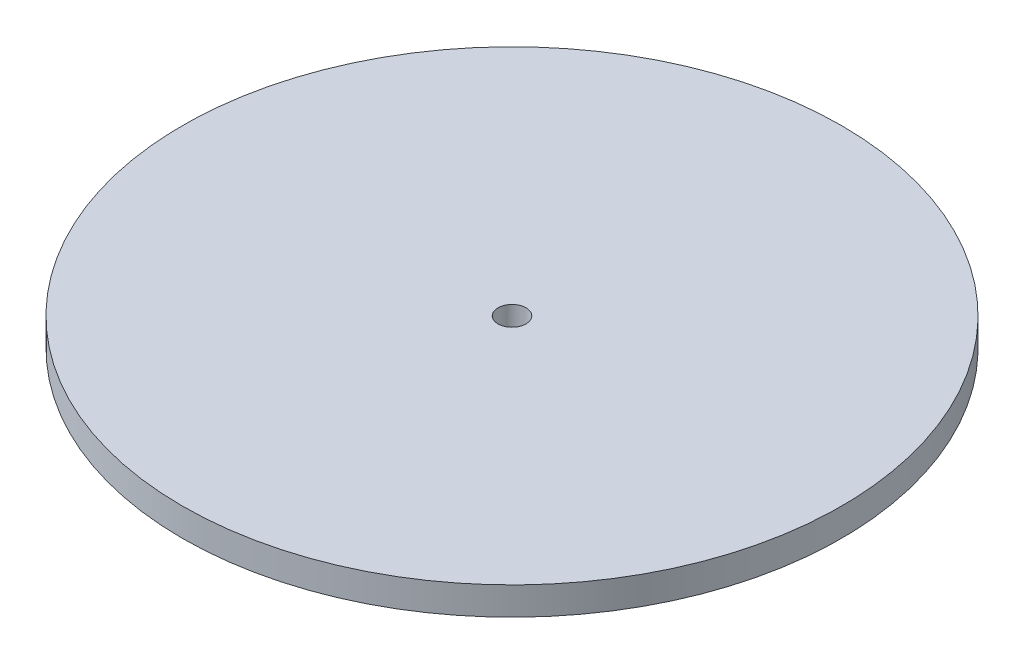
ISO-10303-21;
HEADER;
FILE_DESCRIPTION(('STEP AP214'),'2;1');
FILE_NAME('part.step','',(''),(''),'','','');
FILE_SCHEMA(('AUTOMOTIVE_DESIGN { 1 0 10303 214 1 1 1 1 }'));
ENDSEC;
DATA;
#1=APPLICATION_CONTEXT('core data for automotive mechanical design processes');
#2=APPLICATION_PROTOCOL_DEFINITION('international standard','automotive_design',2000,#1);
#3=PRODUCT_CONTEXT('',#1,'mechanical');
#4=PRODUCT('Part','Part','',(#3));
#5=PRODUCT_RELATED_PRODUCT_CATEGORY('part','',(#4));
#6=PRODUCT_DEFINITION_FORMATION('','',#4);
#7=PRODUCT_DEFINITION_CONTEXT('part definition',#1,'design');
#8=PRODUCT_DEFINITION('design','',#6,#7);
#9=PRODUCT_DEFINITION_SHAPE('','',#8);
#10=(LENGTH_UNIT() NAMED_UNIT(*) SI_UNIT(.MILLI.,.METRE.));
#11=(NAMED_UNIT(*) PLANE_ANGLE_UNIT() SI_UNIT($,.RADIAN.));
#12=(NAMED_UNIT(*) SI_UNIT($,.STERADIAN.) SOLID_ANGLE_UNIT());
#13=UNCERTAINTY_MEASURE_WITH_UNIT(LENGTH_MEASURE(1.E-05),#10,'distance_accuracy_value','');
#14=(GEOMETRIC_REPRESENTATION_CONTEXT(3) GLOBAL_UNCERTAINTY_ASSIGNED_CONTEXT((#13)) GLOBAL_UNIT_ASSIGNED_CONTEXT((#10,
#11,#12)) REPRESENTATION_CONTEXT('',''));
#15=CARTESIAN_POINT('',(0.,0.,0.));
#16=DIRECTION('',(0.,0.,1.));
#17=DIRECTION('',(1.,0.,0.));
#18=AXIS2_PLACEMENT_3D('',#15,#16,#17);
#19=CARTESIAN_POINT('',(0.,3.175,0.));
#20=DIRECTION('',(0.,-1.,0.));
#21=DIRECTION('',(0.,0.,-1.));
#22=AXIS2_PLACEMENT_3D('',#19,#20,#21);
#23=CYLINDRICAL_SURFACE('',#22,74.7776);
#24=CARTESIAN_POINT('',(0.,3.175,0.));
#25=DIRECTION('',(0.,1.,0.));
#26=DIRECTION('',(0.,0.,1.));
#27=AXIS2_PLACEMENT_3D('',#24,#25,#26);
#28=CIRCLE('',#27,74.7776);
#29=CARTESIAN_POINT('',(0.,3.175,74.7776));
#30=VERTEX_POINT('',#29);
#31=EDGE_CURVE('E10',#30,#30,#28,.T.);
#32=ORIENTED_EDGE('',*,*,#31,.F.);
#33=EDGE_LOOP('',(#32));
#34=FACE_BOUND('',#33,.T.);
#35=CARTESIAN_POINT('',(0.,-3.175,0.));
#36=DIRECTION('',(0.,1.,0.));
#37=DIRECTION('',(0.,0.,1.));
#38=AXIS2_PLACEMENT_3D('',#35,#36,#37);
#39=CIRCLE('',#38,74.7776);
#40=CARTESIAN_POINT('',(0.,-3.175,74.7776));
#41=VERTEX_POINT('',#40);
#42=EDGE_CURVE('E34',#41,#41,#39,.T.);
#43=ORIENTED_EDGE('',*,*,#42,.T.);
#44=EDGE_LOOP('',(#43));
#45=FACE_BOUND('',#44,.T.);
#46=ADVANCED_FACE('F31',(#34,#45),#23,.T.);
#47=CARTESIAN_POINT('',(0.,3.175,0.));
#48=DIRECTION('',(0.,1.,0.));
#49=DIRECTION('',(0.,0.,1.));
#50=AXIS2_PLACEMENT_3D('',#47,#48,#49);
#51=PLANE('',#50);
#52=CARTESIAN_POINT('',(0.,3.175,0.));
#53=DIRECTION('',(0.,1.,0.));
#54=DIRECTION('',(0.,0.,1.));
#55=AXIS2_PLACEMENT_3D('',#52,#53,#54);
#56=CIRCLE('',#55,3.175);
#57=CARTESIAN_POINT('',(0.,3.175,3.175));
#58=VERTEX_POINT('',#57);
#59=EDGE_CURVE('E45',#58,#58,#56,.T.);
#60=ORIENTED_EDGE('',*,*,#59,.F.);
#61=EDGE_LOOP('',(#60));
#62=FACE_BOUND('',#61,.T.);
#63=ORIENTED_EDGE('',*,*,#31,.T.);
#64=EDGE_LOOP('',(#63));
#65=FACE_BOUND('',#64,.T.);
#66=ADVANCED_FACE('F52',(#62,#65),#51,.T.);
#67=CARTESIAN_POINT('',(0.,-3.175,0.));
#68=DIRECTION('',(0.,1.,0.));
#69=DIRECTION('',(0.,0.,1.));
#70=AXIS2_PLACEMENT_3D('',#67,#68,#69);
#71=PLANE('',#70);
#72=CARTESIAN_POINT('',(0.,-3.175,0.));
#73=DIRECTION('',(0.,1.,0.));
#74=DIRECTION('',(0.,0.,1.));
#75=AXIS2_PLACEMENT_3D('',#72,#73,#74);
#76=CIRCLE('',#75,3.175);
#77=CARTESIAN_POINT('',(0.,-3.175,3.175));
#78=VERTEX_POINT('',#77);
#79=EDGE_CURVE('E41',#78,#78,#76,.F.);
#80=ORIENTED_EDGE('',*,*,#79,.F.);
#81=EDGE_LOOP('',(#80));
#82=FACE_BOUND('',#81,.T.);
#83=ORIENTED_EDGE('',*,*,#42,.F.);
#84=EDGE_LOOP('',(#83));
#85=FACE_BOUND('',#84,.T.);
#86=ADVANCED_FACE('F54',(#82,#85),#71,.F.);
#87=CARTESIAN_POINT('',(0.,-3.176,0.));
#88=DIRECTION('',(0.,1.,0.));
#89=DIRECTION('',(0.,0.,1.));
#90=AXIS2_PLACEMENT_3D('',#87,#88,#89);
#91=CYLINDRICAL_SURFACE('',#90,3.175);
#92=ORIENTED_EDGE('',*,*,#59,.T.);
#93=EDGE_LOOP('',(#92));
#94=FACE_BOUND('',#93,.T.);
#95=ORIENTED_EDGE('',*,*,#79,.T.);
#96=EDGE_LOOP('',(#95));
#97=FACE_BOUND('',#96,.T.);
#98=ADVANCED_FACE('F49',(#94,#97),#91,.F.);
#99=CLOSED_SHELL('',(#46,#66,#86,#98));
#100=MANIFOLD_SOLID_BREP('B2',#99);
#101=ADVANCED_BREP_SHAPE_REPRESENTATION('',(#18,#100),#14);
#102=SHAPE_DEFINITION_REPRESENTATION(#9,#101);
ENDSEC;
END-ISO-10303-21;
